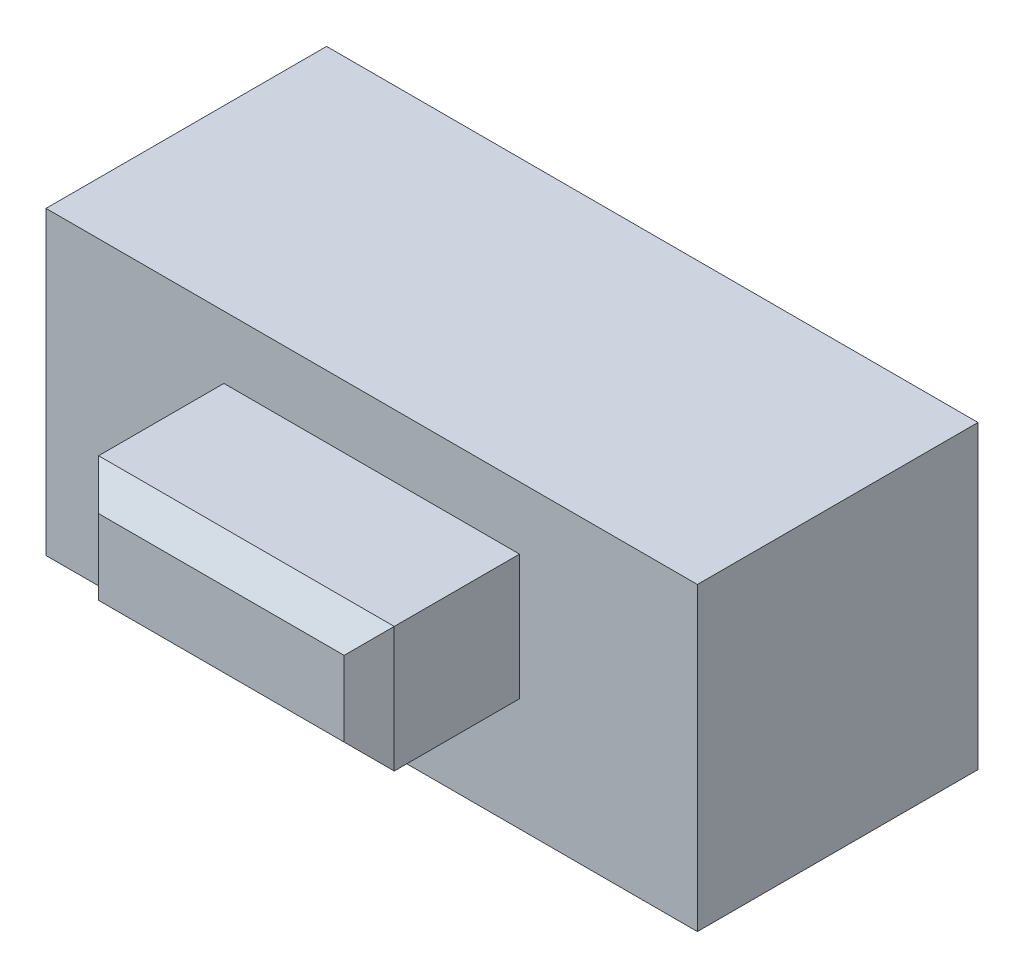
ISO-10303-21;
HEADER;
FILE_DESCRIPTION(('STEP AP214'),'2;1');
FILE_NAME('part.step','',(''),(''),'','','');
FILE_SCHEMA(('AUTOMOTIVE_DESIGN { 1 0 10303 214 1 1 1 1 }'));
ENDSEC;
DATA;
#1=APPLICATION_CONTEXT('core data for automotive mechanical design processes');
#2=APPLICATION_PROTOCOL_DEFINITION('international standard','automotive_design',2000,#1);
#3=PRODUCT_CONTEXT('',#1,'mechanical');
#4=PRODUCT('Part','Part','',(#3));
#5=PRODUCT_RELATED_PRODUCT_CATEGORY('part','',(#4));
#6=PRODUCT_DEFINITION_FORMATION('','',#4);
#7=PRODUCT_DEFINITION_CONTEXT('part definition',#1,'design');
#8=PRODUCT_DEFINITION('design','',#6,#7);
#9=PRODUCT_DEFINITION_SHAPE('','',#8);
#10=(LENGTH_UNIT() NAMED_UNIT(*) SI_UNIT(.MILLI.,.METRE.));
#11=(NAMED_UNIT(*) PLANE_ANGLE_UNIT() SI_UNIT($,.RADIAN.));
#12=(NAMED_UNIT(*) SI_UNIT($,.STERADIAN.) SOLID_ANGLE_UNIT());
#13=UNCERTAINTY_MEASURE_WITH_UNIT(LENGTH_MEASURE(1.E-05),#10,'distance_accuracy_value','');
#14=(GEOMETRIC_REPRESENTATION_CONTEXT(3) GLOBAL_UNCERTAINTY_ASSIGNED_CONTEXT((#13)) GLOBAL_UNIT_ASSIGNED_CONTEXT((#10,
#11,#12)) REPRESENTATION_CONTEXT('',''));
#15=CARTESIAN_POINT('',(0.,0.,0.));
#16=DIRECTION('',(0.,0.,1.));
#17=DIRECTION('',(1.,0.,0.));
#18=AXIS2_PLACEMENT_3D('',#15,#16,#17);
#19=CARTESIAN_POINT('',(-6.5,6.,2.8));
#20=DIRECTION('',(0.,0.,-1.));
#21=DIRECTION('',(-1.,0.,0.));
#22=AXIS2_PLACEMENT_3D('',#19,#20,#21);
#23=PLANE('',#22);
#24=DIRECTION('',(1.,0.,0.));
#25=VECTOR('',#24,1.);
#26=CARTESIAN_POINT('',(-6.5,0.,2.8));
#27=LINE('',#26,#25);
#28=CARTESIAN_POINT('',(-6.5,0.,2.8));
#29=VERTEX_POINT('',#28);
#30=CARTESIAN_POINT('',(6.5,0.,2.8));
#31=VERTEX_POINT('',#30);
#32=EDGE_CURVE('E144',#29,#31,#27,.T.);
#33=ORIENTED_EDGE('',*,*,#32,.T.);
#34=DIRECTION('',(0.,-1.,0.));
#35=VECTOR('',#34,1.);
#36=CARTESIAN_POINT('',(6.5,6.,2.8));
#37=LINE('',#36,#35);
#38=CARTESIAN_POINT('',(6.5,6.,2.8));
#39=VERTEX_POINT('',#38);
#40=EDGE_CURVE('E150',#39,#31,#37,.T.);
#41=ORIENTED_EDGE('',*,*,#40,.F.);
#42=DIRECTION('',(1.,0.,0.));
#43=VECTOR('',#42,1.);
#44=CARTESIAN_POINT('',(-6.5,6.,2.8));
#45=LINE('',#44,#43);
#46=CARTESIAN_POINT('',(-6.5,6.,2.8));
#47=VERTEX_POINT('',#46);
#48=EDGE_CURVE('E148',#47,#39,#45,.T.);
#49=ORIENTED_EDGE('',*,*,#48,.F.);
#50=DIRECTION('',(0.,-1.,0.));
#51=VECTOR('',#50,1.);
#52=CARTESIAN_POINT('',(-6.5,6.,2.8));
#53=LINE('',#52,#51);
#54=EDGE_CURVE('E160',#47,#29,#53,.T.);
#55=ORIENTED_EDGE('',*,*,#54,.T.);
#56=EDGE_LOOP('',(#33,#41,#49,#55));
#57=FACE_BOUND('',#56,.T.);
#58=DIRECTION('',(0.,1.,0.));
#59=VECTOR('',#58,1.);
#60=CARTESIAN_POINT('',(2.95,2.25,2.8));
#61=LINE('',#60,#59);
#62=CARTESIAN_POINT('',(2.95,2.25,2.8));
#63=VERTEX_POINT('',#62);
#64=CARTESIAN_POINT('',(2.95,4.75,2.8));
#65=VERTEX_POINT('',#64);
#66=EDGE_CURVE('E113',#63,#65,#61,.T.);
#67=ORIENTED_EDGE('',*,*,#66,.F.);
#68=DIRECTION('',(1.,0.,0.));
#69=VECTOR('',#68,1.);
#70=CARTESIAN_POINT('',(-2.95,2.25,2.8));
#71=LINE('',#70,#69);
#72=CARTESIAN_POINT('',(-2.95,2.25,2.8));
#73=VERTEX_POINT('',#72);
#74=EDGE_CURVE('E118',#73,#63,#71,.T.);
#75=ORIENTED_EDGE('',*,*,#74,.F.);
#76=DIRECTION('',(0.,-1.,0.));
#77=VECTOR('',#76,1.);
#78=CARTESIAN_POINT('',(-2.95,2.25,2.8));
#79=LINE('',#78,#77);
#80=CARTESIAN_POINT('',(-2.95,4.75,2.8));
#81=VERTEX_POINT('',#80);
#82=EDGE_CURVE('E129',#81,#73,#79,.T.);
#83=ORIENTED_EDGE('',*,*,#82,.F.);
#84=DIRECTION('',(-1.,0.,0.));
#85=VECTOR('',#84,1.);
#86=CARTESIAN_POINT('',(-2.95,4.75,2.8));
#87=LINE('',#86,#85);
#88=EDGE_CURVE('E126',#65,#81,#87,.T.);
#89=ORIENTED_EDGE('',*,*,#88,.F.);
#90=EDGE_LOOP('',(#67,#75,#83,#89));
#91=FACE_BOUND('',#90,.T.);
#92=ADVANCED_FACE('F32',(#57,#91),#23,.F.);
#93=CARTESIAN_POINT('',(6.5,6.,2.8));
#94=DIRECTION('',(-1.,0.,0.));
#95=DIRECTION('',(0.,0.,1.));
#96=AXIS2_PLACEMENT_3D('',#93,#94,#95);
#97=PLANE('',#96);
#98=DIRECTION('',(0.,0.,-1.));
#99=VECTOR('',#98,1.);
#100=CARTESIAN_POINT('',(6.5,0.,2.8));
#101=LINE('',#100,#99);
#102=CARTESIAN_POINT('',(6.5,0.,-2.8));
#103=VERTEX_POINT('',#102);
#104=EDGE_CURVE('E139',#31,#103,#101,.T.);
#105=ORIENTED_EDGE('',*,*,#104,.T.);
#106=DIRECTION('',(0.,-1.,0.));
#107=VECTOR('',#106,1.);
#108=CARTESIAN_POINT('',(6.5,6.,-2.8));
#109=LINE('',#108,#107);
#110=CARTESIAN_POINT('',(6.5,6.,-2.8));
#111=VERTEX_POINT('',#110);
#112=EDGE_CURVE('E166',#111,#103,#109,.T.);
#113=ORIENTED_EDGE('',*,*,#112,.F.);
#114=DIRECTION('',(0.,0.,-1.));
#115=VECTOR('',#114,1.);
#116=CARTESIAN_POINT('',(6.5,6.,2.8));
#117=LINE('',#116,#115);
#118=EDGE_CURVE('E140',#39,#111,#117,.T.);
#119=ORIENTED_EDGE('',*,*,#118,.F.);
#120=ORIENTED_EDGE('',*,*,#40,.T.);
#121=EDGE_LOOP('',(#105,#113,#119,#120));
#122=FACE_BOUND('',#121,.T.);
#123=ADVANCED_FACE('F217',(#122),#97,.F.);
#124=CARTESIAN_POINT('',(-6.5,6.,-2.8));
#125=DIRECTION('',(0.,0.,1.));
#126=DIRECTION('',(1.,0.,0.));
#127=AXIS2_PLACEMENT_3D('',#124,#125,#126);
#128=PLANE('',#127);
#129=DIRECTION('',(-1.,0.,0.));
#130=VECTOR('',#129,1.);
#131=CARTESIAN_POINT('',(-6.5,0.,-2.8));
#132=LINE('',#131,#130);
#133=CARTESIAN_POINT('',(-6.5,0.,-2.8));
#134=VERTEX_POINT('',#133);
#135=EDGE_CURVE('E153',#103,#134,#132,.T.);
#136=ORIENTED_EDGE('',*,*,#135,.T.);
#137=DIRECTION('',(0.,-1.,0.));
#138=VECTOR('',#137,1.);
#139=CARTESIAN_POINT('',(-6.5,6.,-2.8));
#140=LINE('',#139,#138);
#141=CARTESIAN_POINT('',(-6.5,6.,-2.8));
#142=VERTEX_POINT('',#141);
#143=EDGE_CURVE('E163',#142,#134,#140,.T.);
#144=ORIENTED_EDGE('',*,*,#143,.F.);
#145=DIRECTION('',(-1.,0.,0.));
#146=VECTOR('',#145,1.);
#147=CARTESIAN_POINT('',(-6.5,6.,-2.8));
#148=LINE('',#147,#146);
#149=EDGE_CURVE('E143',#111,#142,#148,.T.);
#150=ORIENTED_EDGE('',*,*,#149,.F.);
#151=ORIENTED_EDGE('',*,*,#112,.T.);
#152=EDGE_LOOP('',(#136,#144,#150,#151));
#153=FACE_BOUND('',#152,.T.);
#154=ADVANCED_FACE('F223',(#153),#128,.F.);
#155=CARTESIAN_POINT('',(-6.5,6.,2.8));
#156=DIRECTION('',(1.,0.,0.));
#157=DIRECTION('',(0.,0.,-1.));
#158=AXIS2_PLACEMENT_3D('',#155,#156,#157);
#159=PLANE('',#158);
#160=DIRECTION('',(0.,0.,1.));
#161=VECTOR('',#160,1.);
#162=CARTESIAN_POINT('',(-6.5,0.,2.8));
#163=LINE('',#162,#161);
#164=EDGE_CURVE('E155',#134,#29,#163,.T.);
#165=ORIENTED_EDGE('',*,*,#164,.T.);
#166=ORIENTED_EDGE('',*,*,#54,.F.);
#167=DIRECTION('',(0.,0.,1.));
#168=VECTOR('',#167,1.);
#169=CARTESIAN_POINT('',(-6.5,6.,2.8));
#170=LINE('',#169,#168);
#171=EDGE_CURVE('E146',#142,#47,#170,.T.);
#172=ORIENTED_EDGE('',*,*,#171,.F.);
#173=ORIENTED_EDGE('',*,*,#143,.T.);
#174=EDGE_LOOP('',(#165,#166,#172,#173));
#175=FACE_BOUND('',#174,.T.);
#176=ADVANCED_FACE('F230',(#175),#159,.F.);
#177=CARTESIAN_POINT('',(0.,6.,0.));
#178=DIRECTION('',(0.,-1.,0.));
#179=DIRECTION('',(0.,0.,-1.));
#180=AXIS2_PLACEMENT_3D('',#177,#178,#179);
#181=PLANE('',#180);
#182=ORIENTED_EDGE('',*,*,#118,.T.);
#183=ORIENTED_EDGE('',*,*,#149,.T.);
#184=ORIENTED_EDGE('',*,*,#171,.T.);
#185=ORIENTED_EDGE('',*,*,#48,.T.);
#186=EDGE_LOOP('',(#182,#183,#184,#185));
#187=FACE_BOUND('',#186,.T.);
#188=ADVANCED_FACE('F233',(#187),#181,.F.);
#189=CARTESIAN_POINT('',(0.,0.,0.));
#190=DIRECTION('',(0.,-1.,0.));
#191=DIRECTION('',(0.,0.,-1.));
#192=AXIS2_PLACEMENT_3D('',#189,#190,#191);
#193=PLANE('',#192);
#194=ORIENTED_EDGE('',*,*,#104,.F.);
#195=ORIENTED_EDGE('',*,*,#32,.F.);
#196=ORIENTED_EDGE('',*,*,#164,.F.);
#197=ORIENTED_EDGE('',*,*,#135,.F.);
#198=EDGE_LOOP('',(#194,#195,#196,#197));
#199=FACE_BOUND('',#198,.T.);
#200=ADVANCED_FACE('F228',(#199),#193,.T.);
#201=CARTESIAN_POINT('',(2.95,2.25,5.8));
#202=DIRECTION('',(-1.,0.,0.));
#203=DIRECTION('',(0.,0.,1.));
#204=AXIS2_PLACEMENT_3D('',#201,#202,#203);
#205=PLANE('',#204);
#206=DIRECTION('',(0.,0.,-1.));
#207=VECTOR('',#206,1.);
#208=CARTESIAN_POINT('',(2.95,4.75,5.8));
#209=LINE('',#208,#207);
#210=CARTESIAN_POINT('',(2.95,4.75,5.29999999999999));
#211=VERTEX_POINT('',#210);
#212=EDGE_CURVE('E137',#211,#65,#209,.T.);
#213=ORIENTED_EDGE('',*,*,#212,.F.);
#214=DIRECTION('',(0.,-1.,0.));
#215=VECTOR('',#214,1.);
#216=CARTESIAN_POINT('',(2.95,2.25,5.29999999999999));
#217=LINE('',#216,#215);
#218=CARTESIAN_POINT('',(2.95,2.25,5.29999999999999));
#219=VERTEX_POINT('',#218);
#220=EDGE_CURVE('E115',#211,#219,#217,.T.);
#221=ORIENTED_EDGE('',*,*,#220,.T.);
#222=DIRECTION('',(0.,0.,-1.));
#223=VECTOR('',#222,1.);
#224=CARTESIAN_POINT('',(2.95,2.25,5.8));
#225=LINE('',#224,#223);
#226=EDGE_CURVE('E109',#219,#63,#225,.T.);
#227=ORIENTED_EDGE('',*,*,#226,.T.);
#228=ORIENTED_EDGE('',*,*,#66,.T.);
#229=EDGE_LOOP('',(#213,#221,#227,#228));
#230=FACE_BOUND('',#229,.T.);
#231=ADVANCED_FACE('F112',(#230),#205,.F.);
#232=CARTESIAN_POINT('',(-2.95,4.75,5.8));
#233=DIRECTION('',(0.,-1.,0.));
#234=DIRECTION('',(0.,0.,-1.));
#235=AXIS2_PLACEMENT_3D('',#232,#233,#234);
#236=PLANE('',#235);
#237=DIRECTION('',(0.,0.,-1.));
#238=VECTOR('',#237,1.);
#239=CARTESIAN_POINT('',(-2.95,4.75,5.8));
#240=LINE('',#239,#238);
#241=CARTESIAN_POINT('',(-2.95,4.75,5.29999999999999));
#242=VERTEX_POINT('',#241);
#243=EDGE_CURVE('E135',#242,#81,#240,.T.);
#244=ORIENTED_EDGE('',*,*,#243,.F.);
#245=DIRECTION('',(1.,0.,0.));
#246=VECTOR('',#245,1.);
#247=CARTESIAN_POINT('',(-2.95,4.75,5.29999999999999));
#248=LINE('',#247,#246);
#249=EDGE_CURVE('E179',#242,#211,#248,.T.);
#250=ORIENTED_EDGE('',*,*,#249,.T.);
#251=ORIENTED_EDGE('',*,*,#212,.T.);
#252=ORIENTED_EDGE('',*,*,#88,.T.);
#253=EDGE_LOOP('',(#244,#250,#251,#252));
#254=FACE_BOUND('',#253,.T.);
#255=ADVANCED_FACE('F202',(#254),#236,.F.);
#256=CARTESIAN_POINT('',(-2.95,2.25,5.8));
#257=DIRECTION('',(1.,0.,0.));
#258=DIRECTION('',(0.,0.,-1.));
#259=AXIS2_PLACEMENT_3D('',#256,#257,#258);
#260=PLANE('',#259);
#261=DIRECTION('',(0.,0.,-1.));
#262=VECTOR('',#261,1.);
#263=CARTESIAN_POINT('',(-2.95,2.25,5.8));
#264=LINE('',#263,#262);
#265=CARTESIAN_POINT('',(-2.95,2.25,5.29999999999999));
#266=VERTEX_POINT('',#265);
#267=EDGE_CURVE('E117',#266,#73,#264,.T.);
#268=ORIENTED_EDGE('',*,*,#267,.F.);
#269=DIRECTION('',(0.,1.,0.));
#270=VECTOR('',#269,1.);
#271=CARTESIAN_POINT('',(-2.95,2.25,5.29999999999999));
#272=LINE('',#271,#270);
#273=EDGE_CURVE('E41',#266,#242,#272,.T.);
#274=ORIENTED_EDGE('',*,*,#273,.T.);
#275=ORIENTED_EDGE('',*,*,#243,.T.);
#276=ORIENTED_EDGE('',*,*,#82,.T.);
#277=EDGE_LOOP('',(#268,#274,#275,#276));
#278=FACE_BOUND('',#277,.T.);
#279=ADVANCED_FACE('F214',(#278),#260,.F.);
#280=CARTESIAN_POINT('',(-2.95,2.25,5.8));
#281=DIRECTION('',(0.,1.,0.));
#282=DIRECTION('',(0.,0.,1.));
#283=AXIS2_PLACEMENT_3D('',#280,#281,#282);
#284=PLANE('',#283);
#285=ORIENTED_EDGE('',*,*,#226,.F.);
#286=DIRECTION('',(-1.,0.,0.));
#287=VECTOR('',#286,1.);
#288=CARTESIAN_POINT('',(-2.95,2.25,5.29999999999999));
#289=LINE('',#288,#287);
#290=EDGE_CURVE('E11',#219,#266,#289,.T.);
#291=ORIENTED_EDGE('',*,*,#290,.T.);
#292=ORIENTED_EDGE('',*,*,#267,.T.);
#293=ORIENTED_EDGE('',*,*,#74,.T.);
#294=EDGE_LOOP('',(#285,#291,#292,#293));
#295=FACE_BOUND('',#294,.T.);
#296=ADVANCED_FACE('F128',(#295),#284,.F.);
#297=CARTESIAN_POINT('',(0.,0.,5.8));
#298=DIRECTION('',(0.,0.,-1.));
#299=DIRECTION('',(-1.,0.,0.));
#300=AXIS2_PLACEMENT_3D('',#297,#298,#299);
#301=PLANE('',#300);
#302=DIRECTION('',(1.,0.,0.));
#303=VECTOR('',#302,1.);
#304=CARTESIAN_POINT('',(0.,2.75,5.8));
#305=LINE('',#304,#303);
#306=CARTESIAN_POINT('',(-2.45,2.75,5.8));
#307=VERTEX_POINT('',#306);
#308=CARTESIAN_POINT('',(2.45,2.75,5.8));
#309=VERTEX_POINT('',#308);
#310=EDGE_CURVE('E169',#307,#309,#305,.T.);
#311=ORIENTED_EDGE('',*,*,#310,.T.);
#312=DIRECTION('',(0.,1.,0.));
#313=VECTOR('',#312,1.);
#314=CARTESIAN_POINT('',(2.45,0.,5.8));
#315=LINE('',#314,#313);
#316=CARTESIAN_POINT('',(2.45,4.25,5.8));
#317=VERTEX_POINT('',#316);
#318=EDGE_CURVE('E175',#309,#317,#315,.T.);
#319=ORIENTED_EDGE('',*,*,#318,.T.);
#320=DIRECTION('',(-1.,0.,0.));
#321=VECTOR('',#320,1.);
#322=CARTESIAN_POINT('',(0.,4.25,5.8));
#323=LINE('',#322,#321);
#324=CARTESIAN_POINT('',(-2.45,4.25,5.8));
#325=VERTEX_POINT('',#324);
#326=EDGE_CURVE('E173',#317,#325,#323,.T.);
#327=ORIENTED_EDGE('',*,*,#326,.T.);
#328=DIRECTION('',(0.,-1.,0.));
#329=VECTOR('',#328,1.);
#330=CARTESIAN_POINT('',(-2.45,0.,5.8));
#331=LINE('',#330,#329);
#332=EDGE_CURVE('E171',#325,#307,#331,.T.);
#333=ORIENTED_EDGE('',*,*,#332,.T.);
#334=EDGE_LOOP('',(#311,#319,#327,#333));
#335=FACE_BOUND('',#334,.T.);
#336=ADVANCED_FACE('F207',(#335),#301,.F.);
#337=CARTESIAN_POINT('',(-2.45,0.,5.8));
#338=DIRECTION('',(0.70710678118655,0.,-0.707106781186545));
#339=DIRECTION('',(0.,-1.,0.));
#340=AXIS2_PLACEMENT_3D('',#337,#338,#339);
#341=PLANE('',#340);
#342=DIRECTION('',(-0.577350269189624,0.577350269189624,-0.577350269189629));
#343=VECTOR('',#342,1.);
#344=CARTESIAN_POINT('',(-1.03333333333334,2.83333333333334,7.21666666666667));
#345=LINE('',#344,#343);
#346=EDGE_CURVE('E185',#242,#325,#345,.F.);
#347=ORIENTED_EDGE('',*,*,#346,.F.);
#348=ORIENTED_EDGE('',*,*,#273,.F.);
#349=DIRECTION('',(-0.577350269189624,-0.577350269189624,-0.577350269189629));
#350=VECTOR('',#349,1.);
#351=CARTESIAN_POINT('',(-1.63333333333334,3.56666666666666,6.61666666666667));
#352=LINE('',#351,#350);
#353=EDGE_CURVE('E36',#307,#266,#352,.T.);
#354=ORIENTED_EDGE('',*,*,#353,.F.);
#355=ORIENTED_EDGE('',*,*,#332,.F.);
#356=EDGE_LOOP('',(#347,#348,#354,#355));
#357=FACE_BOUND('',#356,.T.);
#358=ADVANCED_FACE('F34',(#357),#341,.F.);
#359=CARTESIAN_POINT('',(0.,2.75,5.8));
#360=DIRECTION('',(0.,0.70710678118655,-0.707106781186545));
#361=DIRECTION('',(1.,0.,0.));
#362=AXIS2_PLACEMENT_3D('',#359,#360,#361);
#363=PLANE('',#362);
#364=ORIENTED_EDGE('',*,*,#353,.T.);
#365=ORIENTED_EDGE('',*,*,#290,.F.);
#366=DIRECTION('',(-0.577350269189624,0.577350269189624,0.577350269189629));
#367=VECTOR('',#366,1.);
#368=CARTESIAN_POINT('',(1.63333333333334,3.56666666666666,6.61666666666667));
#369=LINE('',#368,#367);
#370=EDGE_CURVE('E184',#309,#219,#369,.F.);
#371=ORIENTED_EDGE('',*,*,#370,.F.);
#372=ORIENTED_EDGE('',*,*,#310,.F.);
#373=EDGE_LOOP('',(#364,#365,#371,#372));
#374=FACE_BOUND('',#373,.T.);
#375=ADVANCED_FACE('F195',(#374),#363,.F.);
#376=CARTESIAN_POINT('',(0.,4.25,5.8));
#377=DIRECTION('',(0.,-0.70710678118655,-0.707106781186545));
#378=DIRECTION('',(-1.,0.,0.));
#379=AXIS2_PLACEMENT_3D('',#376,#377,#378);
#380=PLANE('',#379);
#381=ORIENTED_EDGE('',*,*,#346,.T.);
#382=ORIENTED_EDGE('',*,*,#326,.F.);
#383=DIRECTION('',(0.577350269189624,0.577350269189624,-0.577350269189629));
#384=VECTOR('',#383,1.);
#385=CARTESIAN_POINT('',(1.63333333333334,3.43333333333334,6.61666666666667));
#386=LINE('',#385,#384);
#387=EDGE_CURVE('E182',#211,#317,#386,.F.);
#388=ORIENTED_EDGE('',*,*,#387,.F.);
#389=ORIENTED_EDGE('',*,*,#249,.F.);
#390=EDGE_LOOP('',(#381,#382,#388,#389));
#391=FACE_BOUND('',#390,.T.);
#392=ADVANCED_FACE('F200',(#391),#380,.F.);
#393=CARTESIAN_POINT('',(2.45,0.,5.8));
#394=DIRECTION('',(-0.70710678118655,0.,-0.707106781186545));
#395=DIRECTION('',(0.,1.,0.));
#396=AXIS2_PLACEMENT_3D('',#393,#394,#395);
#397=PLANE('',#396);
#398=ORIENTED_EDGE('',*,*,#370,.T.);
#399=ORIENTED_EDGE('',*,*,#220,.F.);
#400=ORIENTED_EDGE('',*,*,#387,.T.);
#401=ORIENTED_EDGE('',*,*,#318,.F.);
#402=EDGE_LOOP('',(#398,#399,#400,#401));
#403=FACE_BOUND('',#402,.T.);
#404=ADVANCED_FACE('F204',(#403),#397,.F.);
#405=CLOSED_SHELL('',(#92,#123,#154,#176,#188,#200,#231,#255,#279,#296,#336,#358,#375,#392,#404));
#406=MANIFOLD_SOLID_BREP('B2',#405);
#407=ADVANCED_BREP_SHAPE_REPRESENTATION('',(#18,#406),#14);
#408=SHAPE_DEFINITION_REPRESENTATION(#9,#407);
ENDSEC;
END-ISO-10303-21;
